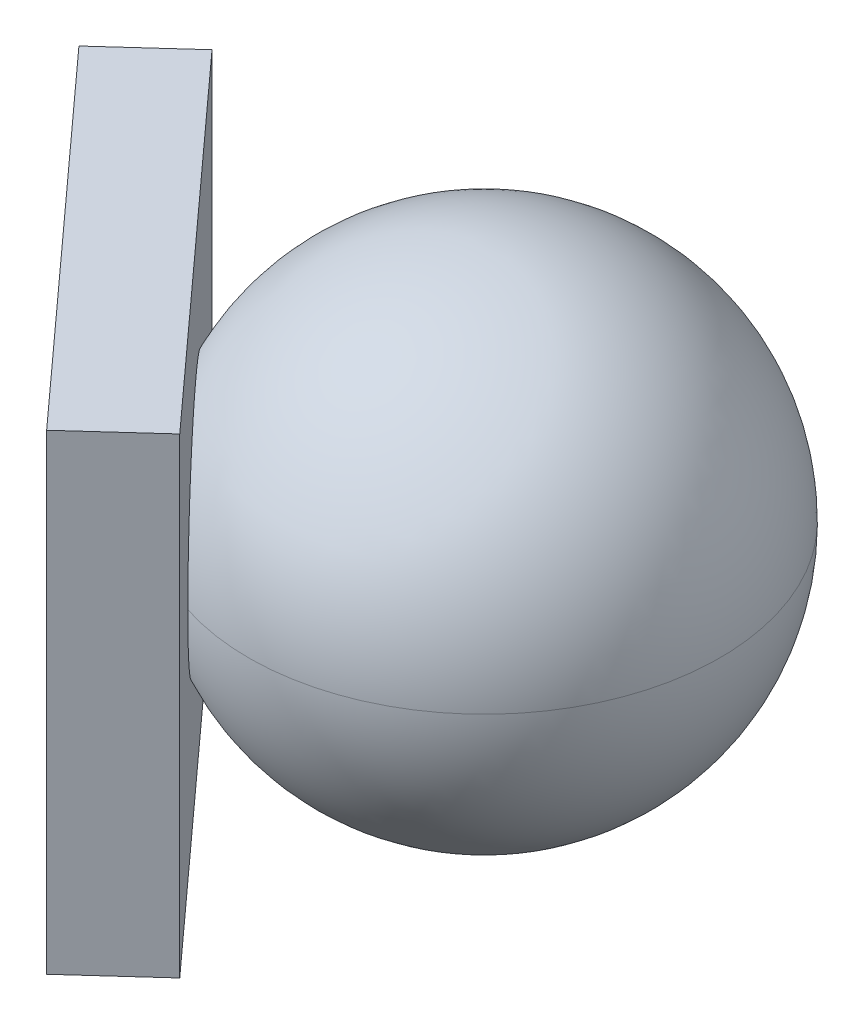
ISO-10303-21;
HEADER;
FILE_DESCRIPTION(('STEP AP214'),'2;1');
FILE_NAME('part.step','',(''),(''),'','','');
FILE_SCHEMA(('AUTOMOTIVE_DESIGN { 1 0 10303 214 1 1 1 1 }'));
ENDSEC;
DATA;
#1=APPLICATION_CONTEXT('core data for automotive mechanical design processes');
#2=APPLICATION_PROTOCOL_DEFINITION('international standard','automotive_design',2000,#1);
#3=PRODUCT_CONTEXT('',#1,'mechanical');
#4=PRODUCT('Part','Part','',(#3));
#5=PRODUCT_RELATED_PRODUCT_CATEGORY('part','',(#4));
#6=PRODUCT_DEFINITION_FORMATION('','',#4);
#7=PRODUCT_DEFINITION_CONTEXT('part definition',#1,'design');
#8=PRODUCT_DEFINITION('design','',#6,#7);
#9=PRODUCT_DEFINITION_SHAPE('','',#8);
#10=(LENGTH_UNIT() NAMED_UNIT(*) SI_UNIT(.MILLI.,.METRE.));
#11=(NAMED_UNIT(*) PLANE_ANGLE_UNIT() SI_UNIT($,.RADIAN.));
#12=(NAMED_UNIT(*) SI_UNIT($,.STERADIAN.) SOLID_ANGLE_UNIT());
#13=UNCERTAINTY_MEASURE_WITH_UNIT(LENGTH_MEASURE(1.E-05),#10,'distance_accuracy_value','');
#14=(GEOMETRIC_REPRESENTATION_CONTEXT(3) GLOBAL_UNCERTAINTY_ASSIGNED_CONTEXT((#13)) GLOBAL_UNIT_ASSIGNED_CONTEXT((#10,
#11,#12)) REPRESENTATION_CONTEXT('',''));
#15=CARTESIAN_POINT('',(0.,0.,0.));
#16=DIRECTION('',(0.,0.,1.));
#17=DIRECTION('',(1.,0.,0.));
#18=AXIS2_PLACEMENT_3D('',#15,#16,#17);
#19=CARTESIAN_POINT('',(140.572967925452,0.100523165136014,17.8185840222087));
#20=DIRECTION('',(0.,-1.,0.));
#21=DIRECTION('',(0.,0.,-1.));
#22=AXIS2_PLACEMENT_3D('',#19,#20,#21);
#23=SPHERICAL_SURFACE('',#22,19.05);
#24=CARTESIAN_POINT('',(128.346439879626,0.100523165136014,28.9132724786107));
#25=DIRECTION('',(0.740552879819888,0.,-0.671998089424717));
#26=DIRECTION('',(-0.671998089424717,0.,-0.740552879819888));
#27=AXIS2_PLACEMENT_3D('',#24,#25,#26);
#28=CIRCLE('',#27,9.50380976240582);
#29=CARTESIAN_POINT('',(134.732981882218,0.100523165136018,35.9513461674207));
#30=VERTEX_POINT('',#29);
#31=CARTESIAN_POINT('',(121.959897877033,0.100523165136018,21.8751987898007));
#32=VERTEX_POINT('',#31);
#33=EDGE_CURVE('E95',#30,#32,#28,.F.);
#34=ORIENTED_EDGE('',*,*,#33,.F.);
#35=CARTESIAN_POINT('',(140.572967925452,0.100523165136018,17.8185840222087));
#36=DIRECTION('',(0.,-1.,0.));
#37=DIRECTION('',(0.,0.,-1.));
#38=AXIS2_PLACEMENT_3D('',#35,#36,#37);
#39=CIRCLE('',#38,19.05);
#40=EDGE_CURVE('E50',#32,#30,#39,.T.);
#41=ORIENTED_EDGE('',*,*,#40,.F.);
#42=EDGE_LOOP('',(#34,#41));
#43=FACE_BOUND('',#42,.T.);
#44=ADVANCED_FACE('F43',(#43),#23,.T.);
#45=CARTESIAN_POINT('',(140.572967925452,0.100523165136014,17.8185840222087));
#46=DIRECTION('',(0.,-1.,0.));
#47=DIRECTION('',(0.,0.,-1.));
#48=AXIS2_PLACEMENT_3D('',#45,#46,#47);
#49=SPHERICAL_SURFACE('',#48,19.05);
#50=CARTESIAN_POINT('',(128.346439879626,0.100523165136014,28.9132724786107));
#51=DIRECTION('',(0.740552879819888,0.,-0.671998089424717));
#52=DIRECTION('',(-0.671998089424717,0.,-0.740552879819888));
#53=AXIS2_PLACEMENT_3D('',#50,#51,#52);
#54=CIRCLE('',#53,9.50380976240582);
#55=EDGE_CURVE('E11',#32,#30,#54,.F.);
#56=ORIENTED_EDGE('',*,*,#55,.F.);
#57=ORIENTED_EDGE('',*,*,#40,.T.);
#58=EDGE_LOOP('',(#56,#57));
#59=FACE_BOUND('',#58,.T.);
#60=ADVANCED_FACE('F132',(#59),#49,.T.);
#61=CARTESIAN_POINT('',(141.148003483167,19.150523165136,43.0208048391796));
#62=DIRECTION('',(-0.671998089424717,0.,-0.740552879819889));
#63=DIRECTION('',(-0.740552879819889,0.,0.671998089424717));
#64=AXIS2_PLACEMENT_3D('',#61,#62,#63);
#65=PLANE('',#64);
#66=DIRECTION('',(-0.740552879819889,0.,0.671998089424717));
#67=VECTOR('',#66,1.);
#68=CARTESIAN_POINT('',(141.148003483167,19.150523165136,43.0208048391796));
#69=LINE('',#68,#67);
#70=CARTESIAN_POINT('',(141.148003483167,19.150523165136,43.0208048391796));
#71=VERTEX_POINT('',#70);
#72=CARTESIAN_POINT('',(135.504990538939,19.150523165136,48.1414302805959));
#73=VERTEX_POINT('',#72);
#74=EDGE_CURVE('E108',#71,#73,#69,.T.);
#75=ORIENTED_EDGE('',*,*,#74,.T.);
#76=DIRECTION('',(0.,-1.,0.));
#77=VECTOR('',#76,1.);
#78=CARTESIAN_POINT('',(135.504990538939,19.150523165136,48.1414302805959));
#79=LINE('',#78,#77);
#80=CARTESIAN_POINT('',(135.504990538939,-18.949476834864,48.1414302805959));
#81=VERTEX_POINT('',#80);
#82=EDGE_CURVE('E102',#73,#81,#79,.T.);
#83=ORIENTED_EDGE('',*,*,#82,.T.);
#84=DIRECTION('',(-0.740552879819889,0.,0.671998089424717));
#85=VECTOR('',#84,1.);
#86=CARTESIAN_POINT('',(141.148003483167,-18.949476834864,43.0208048391796));
#87=LINE('',#86,#85);
#88=CARTESIAN_POINT('',(141.148003483167,-18.949476834864,43.0208048391796));
#89=VERTEX_POINT('',#88);
#90=EDGE_CURVE('E84',#89,#81,#87,.T.);
#91=ORIENTED_EDGE('',*,*,#90,.F.);
#92=DIRECTION('',(0.,-1.,0.));
#93=VECTOR('',#92,1.);
#94=CARTESIAN_POINT('',(141.148003483167,19.150523165136,43.0208048391796));
#95=LINE('',#94,#93);
#96=EDGE_CURVE('E115',#71,#89,#95,.T.);
#97=ORIENTED_EDGE('',*,*,#96,.F.);
#98=EDGE_LOOP('',(#75,#83,#91,#97));
#99=FACE_BOUND('',#98,.T.);
#100=ADVANCED_FACE('F106',(#99),#65,.F.);
#101=CARTESIAN_POINT('',(141.148003483167,-18.949476834864,43.0208048391796));
#102=DIRECTION('',(0.,1.,0.));
#103=DIRECTION('',(0.,0.,1.));
#104=AXIS2_PLACEMENT_3D('',#101,#102,#103);
#105=PLANE('',#104);
#106=ORIENTED_EDGE('',*,*,#90,.T.);
#107=DIRECTION('',(-0.671998089424717,0.,-0.740552879819889));
#108=VECTOR('',#107,1.);
#109=CARTESIAN_POINT('',(135.504990538939,-18.949476834864,48.1414302805959));
#110=LINE('',#109,#108);
#111=CARTESIAN_POINT('',(109.901863331857,-18.949476834864,19.9263655594582));
#112=VERTEX_POINT('',#111);
#113=EDGE_CURVE('E88',#81,#112,#110,.T.);
#114=ORIENTED_EDGE('',*,*,#113,.T.);
#115=DIRECTION('',(-0.740552879819889,0.,0.671998089424717));
#116=VECTOR('',#115,1.);
#117=CARTESIAN_POINT('',(115.544876276085,-18.949476834864,14.8057401180418));
#118=LINE('',#117,#116);
#119=CARTESIAN_POINT('',(115.544876276085,-18.949476834864,14.8057401180418));
#120=VERTEX_POINT('',#119);
#121=EDGE_CURVE('E96',#120,#112,#118,.T.);
#122=ORIENTED_EDGE('',*,*,#121,.F.);
#123=DIRECTION('',(-0.671998089424717,0.,-0.740552879819888));
#124=VECTOR('',#123,1.);
#125=CARTESIAN_POINT('',(141.148003483167,-18.949476834864,43.0208048391796));
#126=LINE('',#125,#124);
#127=EDGE_CURVE('E90',#89,#120,#126,.T.);
#128=ORIENTED_EDGE('',*,*,#127,.F.);
#129=EDGE_LOOP('',(#106,#114,#122,#128));
#130=FACE_BOUND('',#129,.T.);
#131=ADVANCED_FACE('F86',(#130),#105,.F.);
#132=CARTESIAN_POINT('',(115.544876276085,-18.949476834864,14.8057401180418));
#133=DIRECTION('',(0.671998089424717,0.,0.740552879819889));
#134=DIRECTION('',(0.740552879819889,0.,-0.671998089424717));
#135=AXIS2_PLACEMENT_3D('',#132,#133,#134);
#136=PLANE('',#135);
#137=ORIENTED_EDGE('',*,*,#121,.T.);
#138=DIRECTION('',(0.,1.,0.));
#139=VECTOR('',#138,1.);
#140=CARTESIAN_POINT('',(109.901863331857,-18.949476834864,19.9263655594582));
#141=LINE('',#140,#139);
#142=CARTESIAN_POINT('',(109.901863331857,19.150523165136,19.9263655594582));
#143=VERTEX_POINT('',#142);
#144=EDGE_CURVE('E104',#112,#143,#141,.T.);
#145=ORIENTED_EDGE('',*,*,#144,.T.);
#146=DIRECTION('',(-0.740552879819889,0.,0.671998089424717));
#147=VECTOR('',#146,1.);
#148=CARTESIAN_POINT('',(115.544876276085,19.150523165136,14.8057401180418));
#149=LINE('',#148,#147);
#150=CARTESIAN_POINT('',(115.544876276085,19.150523165136,14.8057401180418));
#151=VERTEX_POINT('',#150);
#152=EDGE_CURVE('E123',#151,#143,#149,.T.);
#153=ORIENTED_EDGE('',*,*,#152,.F.);
#154=DIRECTION('',(0.,1.,0.));
#155=VECTOR('',#154,1.);
#156=CARTESIAN_POINT('',(115.544876276085,-18.949476834864,14.8057401180418));
#157=LINE('',#156,#155);
#158=EDGE_CURVE('E118',#120,#151,#157,.T.);
#159=ORIENTED_EDGE('',*,*,#158,.F.);
#160=EDGE_LOOP('',(#137,#145,#153,#159));
#161=FACE_BOUND('',#160,.T.);
#162=ADVANCED_FACE('F146',(#161),#136,.F.);
#163=CARTESIAN_POINT('',(115.544876276085,19.150523165136,14.8057401180418));
#164=DIRECTION('',(0.,-1.,0.));
#165=DIRECTION('',(0.,0.,-1.));
#166=AXIS2_PLACEMENT_3D('',#163,#164,#165);
#167=PLANE('',#166);
#168=ORIENTED_EDGE('',*,*,#152,.T.);
#169=DIRECTION('',(0.671998089424717,0.,0.740552879819889));
#170=VECTOR('',#169,1.);
#171=CARTESIAN_POINT('',(109.901863331857,19.150523165136,19.9263655594582));
#172=LINE('',#171,#170);
#173=EDGE_CURVE('E113',#143,#73,#172,.T.);
#174=ORIENTED_EDGE('',*,*,#173,.T.);
#175=ORIENTED_EDGE('',*,*,#74,.F.);
#176=DIRECTION('',(0.671998089424717,0.,0.740552879819888));
#177=VECTOR('',#176,1.);
#178=CARTESIAN_POINT('',(115.544876276085,19.150523165136,14.8057401180418));
#179=LINE('',#178,#177);
#180=EDGE_CURVE('E120',#151,#71,#179,.T.);
#181=ORIENTED_EDGE('',*,*,#180,.F.);
#182=EDGE_LOOP('',(#168,#174,#175,#181));
#183=FACE_BOUND('',#182,.T.);
#184=ADVANCED_FACE('F149',(#183),#167,.F.);
#185=CARTESIAN_POINT('',(55.9988772133428,0.,-50.8149242582758));
#186=DIRECTION('',(0.740552879819888,0.,-0.671998089424717));
#187=DIRECTION('',(-0.671998089424717,0.,-0.740552879819888));
#188=AXIS2_PLACEMENT_3D('',#185,#186,#187);
#189=PLANE('',#188);
#190=ORIENTED_EDGE('',*,*,#55,.T.);
#191=ORIENTED_EDGE('',*,*,#33,.T.);
#192=EDGE_LOOP('',(#190,#191));
#193=FACE_BOUND('',#192,.T.);
#194=ORIENTED_EDGE('',*,*,#96,.T.);
#195=ORIENTED_EDGE('',*,*,#127,.T.);
#196=ORIENTED_EDGE('',*,*,#158,.T.);
#197=ORIENTED_EDGE('',*,*,#180,.T.);
#198=EDGE_LOOP('',(#194,#195,#196,#197));
#199=FACE_BOUND('',#198,.T.);
#200=ADVANCED_FACE('F128',(#193,#199),#189,.T.);
#201=CARTESIAN_POINT('',(50.3558642691152,0.,-45.6942988168594));
#202=DIRECTION('',(0.740552879819889,0.,-0.671998089424717));
#203=DIRECTION('',(-0.671998089424717,0.,-0.740552879819889));
#204=AXIS2_PLACEMENT_3D('',#201,#202,#203);
#205=PLANE('',#204);
#206=ORIENTED_EDGE('',*,*,#82,.F.);
#207=ORIENTED_EDGE('',*,*,#173,.F.);
#208=ORIENTED_EDGE('',*,*,#144,.F.);
#209=ORIENTED_EDGE('',*,*,#113,.F.);
#210=EDGE_LOOP('',(#206,#207,#208,#209));
#211=FACE_BOUND('',#210,.T.);
#212=ADVANCED_FACE('F100',(#211),#205,.F.);
#213=CLOSED_SHELL('',(#44,#60,#100,#131,#162,#184,#200,#212));
#214=MANIFOLD_SOLID_BREP('B2',#213);
#215=ADVANCED_BREP_SHAPE_REPRESENTATION('',(#18,#214),#14);
#216=SHAPE_DEFINITION_REPRESENTATION(#9,#215);
ENDSEC;
END-ISO-10303-21;
